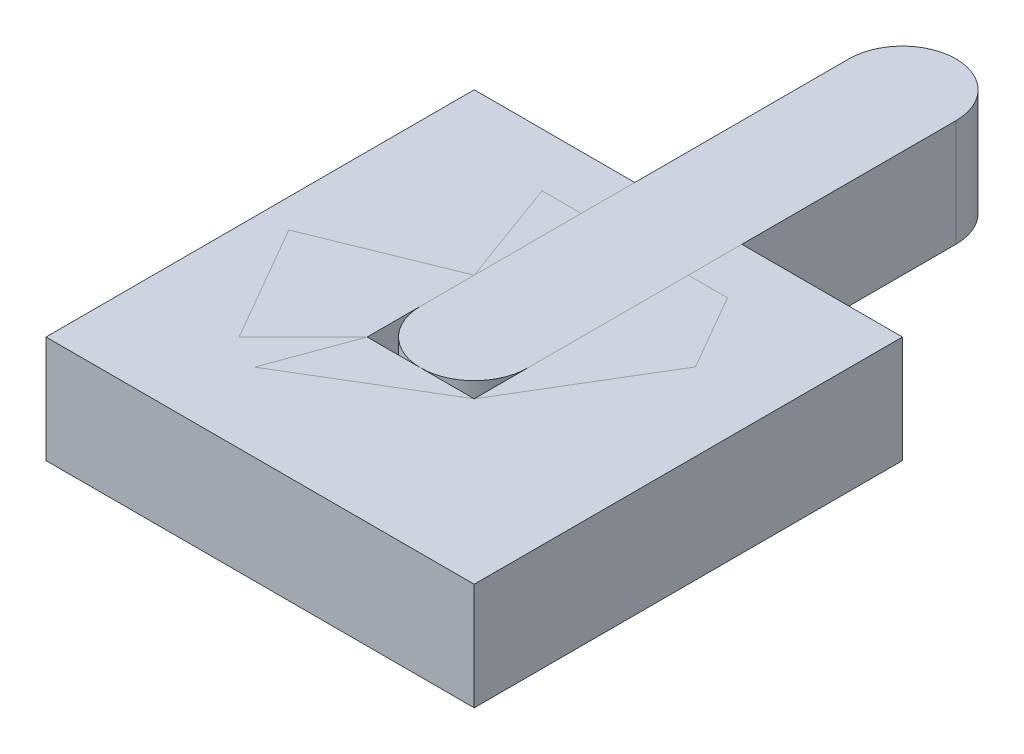
ISO-10303-21;
HEADER;
FILE_DESCRIPTION(('STEP AP214'),'2;1');
FILE_NAME('part.step','',(''),(''),'','','');
FILE_SCHEMA(('AUTOMOTIVE_DESIGN { 1 0 10303 214 1 1 1 1 }'));
ENDSEC;
DATA;
#1=APPLICATION_CONTEXT('core data for automotive mechanical design processes');
#2=APPLICATION_PROTOCOL_DEFINITION('international standard','automotive_design',2000,#1);
#3=PRODUCT_CONTEXT('',#1,'mechanical');
#4=PRODUCT('Part','Part','',(#3));
#5=PRODUCT_RELATED_PRODUCT_CATEGORY('part','',(#4));
#6=PRODUCT_DEFINITION_FORMATION('','',#4);
#7=PRODUCT_DEFINITION_CONTEXT('part definition',#1,'design');
#8=PRODUCT_DEFINITION('design','',#6,#7);
#9=PRODUCT_DEFINITION_SHAPE('','',#8);
#10=(LENGTH_UNIT() NAMED_UNIT(*) SI_UNIT(.MILLI.,.METRE.));
#11=(NAMED_UNIT(*) PLANE_ANGLE_UNIT() SI_UNIT($,.RADIAN.));
#12=(NAMED_UNIT(*) SI_UNIT($,.STERADIAN.) SOLID_ANGLE_UNIT());
#13=UNCERTAINTY_MEASURE_WITH_UNIT(LENGTH_MEASURE(1.E-05),#10,'distance_accuracy_value','');
#14=(GEOMETRIC_REPRESENTATION_CONTEXT(3) GLOBAL_UNCERTAINTY_ASSIGNED_CONTEXT((#13)) GLOBAL_UNIT_ASSIGNED_CONTEXT((#10,
#11,#12)) REPRESENTATION_CONTEXT('',''));
#15=CARTESIAN_POINT('',(0.,0.,0.));
#16=DIRECTION('',(0.,0.,1.));
#17=DIRECTION('',(1.,0.,0.));
#18=AXIS2_PLACEMENT_3D('',#15,#16,#17);
#19=CARTESIAN_POINT('',(1.99185842870421,-2.3,3.45));
#20=DIRECTION('',(0.866025403784439,0.,0.5));
#21=DIRECTION('',(0.5,0.,-0.866025403784439));
#22=AXIS2_PLACEMENT_3D('',#19,#20,#21);
#23=PLANE('',#22);
#24=DIRECTION('',(0.5,0.,-0.866025403784439));
#25=VECTOR('',#24,1.);
#26=CARTESIAN_POINT('',(1.99185842870421,0.,3.45));
#27=LINE('',#26,#25);
#28=CARTESIAN_POINT('',(1.99185842870421,0.,3.45));
#29=VERTEX_POINT('',#28);
#30=CARTESIAN_POINT('',(3.98371685740842,0.,0.));
#31=VERTEX_POINT('',#30);
#32=EDGE_CURVE('E158',#29,#31,#27,.T.);
#33=ORIENTED_EDGE('',*,*,#32,.F.);
#34=DIRECTION('',(0.,1.,0.));
#35=VECTOR('',#34,1.);
#36=CARTESIAN_POINT('',(1.99185842870421,-2.3,3.45));
#37=LINE('',#36,#35);
#38=CARTESIAN_POINT('',(1.99185842870421,-2.3,3.45));
#39=VERTEX_POINT('',#38);
#40=EDGE_CURVE('E12',#39,#29,#37,.T.);
#41=ORIENTED_EDGE('',*,*,#40,.F.);
#42=DIRECTION('',(0.5,0.,-0.866025403784439));
#43=VECTOR('',#42,1.);
#44=CARTESIAN_POINT('',(1.99185842870421,-2.3,3.45));
#45=LINE('',#44,#43);
#46=CARTESIAN_POINT('',(3.98371685740842,-2.3,0.));
#47=VERTEX_POINT('',#46);
#48=EDGE_CURVE('E162',#39,#47,#45,.T.);
#49=ORIENTED_EDGE('',*,*,#48,.T.);
#50=DIRECTION('',(0.,1.,0.));
#51=VECTOR('',#50,1.);
#52=CARTESIAN_POINT('',(3.98371685740842,-2.3,0.));
#53=LINE('',#52,#51);
#54=EDGE_CURVE('E51',#47,#31,#53,.T.);
#55=ORIENTED_EDGE('',*,*,#54,.T.);
#56=EDGE_LOOP('',(#33,#41,#49,#55));
#57=FACE_BOUND('',#56,.T.);
#58=ADVANCED_FACE('F48',(#57),#23,.T.);
#59=CARTESIAN_POINT('',(-1.99185842870421,-2.3,3.45));
#60=DIRECTION('',(0.,0.,1.));
#61=DIRECTION('',(1.,0.,0.));
#62=AXIS2_PLACEMENT_3D('',#59,#60,#61);
#63=PLANE('',#62);
#64=DIRECTION('',(1.,0.,0.));
#65=VECTOR('',#64,1.);
#66=CARTESIAN_POINT('',(-1.99185842870421,0.,3.45));
#67=LINE('',#66,#65);
#68=CARTESIAN_POINT('',(-1.99185842870421,0.,3.45));
#69=VERTEX_POINT('',#68);
#70=EDGE_CURVE('E166',#69,#29,#67,.T.);
#71=ORIENTED_EDGE('',*,*,#70,.F.);
#72=DIRECTION('',(0.,1.,0.));
#73=VECTOR('',#72,1.);
#74=CARTESIAN_POINT('',(-1.99185842870421,-2.3,3.45));
#75=LINE('',#74,#73);
#76=CARTESIAN_POINT('',(-1.99185842870421,-2.3,3.45));
#77=VERTEX_POINT('',#76);
#78=EDGE_CURVE('E56',#77,#69,#75,.T.);
#79=ORIENTED_EDGE('',*,*,#78,.F.);
#80=DIRECTION('',(1.,0.,0.));
#81=VECTOR('',#80,1.);
#82=CARTESIAN_POINT('',(-1.99185842870421,-2.3,3.45));
#83=LINE('',#82,#81);
#84=EDGE_CURVE('E178',#77,#39,#83,.T.);
#85=ORIENTED_EDGE('',*,*,#84,.T.);
#86=ORIENTED_EDGE('',*,*,#40,.T.);
#87=EDGE_LOOP('',(#71,#79,#85,#86));
#88=FACE_BOUND('',#87,.T.);
#89=ADVANCED_FACE('F215',(#88),#63,.T.);
#90=CARTESIAN_POINT('',(-3.98371685740842,-2.3,0.));
#91=DIRECTION('',(-0.866025403784439,0.,0.5));
#92=DIRECTION('',(0.5,0.,0.866025403784439));
#93=AXIS2_PLACEMENT_3D('',#90,#91,#92);
#94=PLANE('',#93);
#95=DIRECTION('',(0.5,0.,0.866025403784439));
#96=VECTOR('',#95,1.);
#97=CARTESIAN_POINT('',(-3.98371685740842,0.,0.));
#98=LINE('',#97,#96);
#99=CARTESIAN_POINT('',(-3.98371685740842,0.,0.));
#100=VERTEX_POINT('',#99);
#101=EDGE_CURVE('E192',#100,#69,#98,.T.);
#102=ORIENTED_EDGE('',*,*,#101,.F.);
#103=DIRECTION('',(0.,1.,0.));
#104=VECTOR('',#103,1.);
#105=CARTESIAN_POINT('',(-3.98371685740842,-2.3,0.));
#106=LINE('',#105,#104);
#107=CARTESIAN_POINT('',(-3.98371685740842,-2.3,0.));
#108=VERTEX_POINT('',#107);
#109=EDGE_CURVE('E198',#108,#100,#106,.T.);
#110=ORIENTED_EDGE('',*,*,#109,.F.);
#111=DIRECTION('',(0.5,0.,0.866025403784439));
#112=VECTOR('',#111,1.);
#113=CARTESIAN_POINT('',(-3.98371685740842,-2.3,0.));
#114=LINE('',#113,#112);
#115=EDGE_CURVE('E175',#108,#77,#114,.T.);
#116=ORIENTED_EDGE('',*,*,#115,.T.);
#117=ORIENTED_EDGE('',*,*,#78,.T.);
#118=EDGE_LOOP('',(#102,#110,#116,#117));
#119=FACE_BOUND('',#118,.T.);
#120=ADVANCED_FACE('F226',(#119),#94,.T.);
#121=CARTESIAN_POINT('',(-1.99185842870421,-2.3,-3.45));
#122=DIRECTION('',(-0.866025403784439,0.,-0.5));
#123=DIRECTION('',(-0.5,0.,0.866025403784439));
#124=AXIS2_PLACEMENT_3D('',#121,#122,#123);
#125=PLANE('',#124);
#126=DIRECTION('',(-0.5,0.,0.866025403784439));
#127=VECTOR('',#126,1.);
#128=CARTESIAN_POINT('',(-1.99185842870421,0.,-3.45));
#129=LINE('',#128,#127);
#130=CARTESIAN_POINT('',(-1.99185842870421,0.,-3.45));
#131=VERTEX_POINT('',#130);
#132=EDGE_CURVE('E189',#131,#100,#129,.T.);
#133=ORIENTED_EDGE('',*,*,#132,.F.);
#134=DIRECTION('',(0.,1.,0.));
#135=VECTOR('',#134,1.);
#136=CARTESIAN_POINT('',(-1.99185842870421,-2.3,-3.45));
#137=LINE('',#136,#135);
#138=CARTESIAN_POINT('',(-1.99185842870421,-2.3,-3.45));
#139=VERTEX_POINT('',#138);
#140=EDGE_CURVE('E200',#139,#131,#137,.T.);
#141=ORIENTED_EDGE('',*,*,#140,.F.);
#142=DIRECTION('',(-0.5,0.,0.866025403784439));
#143=VECTOR('',#142,1.);
#144=CARTESIAN_POINT('',(-1.99185842870421,-2.3,-3.45));
#145=LINE('',#144,#143);
#146=EDGE_CURVE('E172',#139,#108,#145,.T.);
#147=ORIENTED_EDGE('',*,*,#146,.T.);
#148=ORIENTED_EDGE('',*,*,#109,.T.);
#149=EDGE_LOOP('',(#133,#141,#147,#148));
#150=FACE_BOUND('',#149,.T.);
#151=ADVANCED_FACE('F224',(#150),#125,.T.);
#152=CARTESIAN_POINT('',(1.99185842870421,-2.3,-3.45));
#153=DIRECTION('',(0.,0.,-1.));
#154=DIRECTION('',(-1.,0.,0.));
#155=AXIS2_PLACEMENT_3D('',#152,#153,#154);
#156=PLANE('',#155);
#157=DIRECTION('',(-1.,0.,0.));
#158=VECTOR('',#157,1.);
#159=CARTESIAN_POINT('',(1.99185842870421,0.,-3.45));
#160=LINE('',#159,#158);
#161=CARTESIAN_POINT('',(1.99185842870421,0.,-3.45));
#162=VERTEX_POINT('',#161);
#163=EDGE_CURVE('E186',#162,#131,#160,.T.);
#164=ORIENTED_EDGE('',*,*,#163,.F.);
#165=DIRECTION('',(0.,1.,0.));
#166=VECTOR('',#165,1.);
#167=CARTESIAN_POINT('',(1.99185842870421,-2.3,-3.45));
#168=LINE('',#167,#166);
#169=CARTESIAN_POINT('',(1.99185842870421,-2.3,-3.45));
#170=VERTEX_POINT('',#169);
#171=EDGE_CURVE('E201',#170,#162,#168,.T.);
#172=ORIENTED_EDGE('',*,*,#171,.F.);
#173=DIRECTION('',(-1.,0.,0.));
#174=VECTOR('',#173,1.);
#175=CARTESIAN_POINT('',(1.99185842870421,-2.3,-3.45));
#176=LINE('',#175,#174);
#177=EDGE_CURVE('E169',#170,#139,#176,.T.);
#178=ORIENTED_EDGE('',*,*,#177,.T.);
#179=ORIENTED_EDGE('',*,*,#140,.T.);
#180=EDGE_LOOP('',(#164,#172,#178,#179));
#181=FACE_BOUND('',#180,.T.);
#182=ADVANCED_FACE('F221',(#181),#156,.T.);
#183=CARTESIAN_POINT('',(3.98371685740842,-2.3,0.));
#184=DIRECTION('',(0.866025403784439,0.,-0.5));
#185=DIRECTION('',(-0.5,0.,-0.866025403784439));
#186=AXIS2_PLACEMENT_3D('',#183,#184,#185);
#187=PLANE('',#186);
#188=DIRECTION('',(-0.5,0.,-0.866025403784439));
#189=VECTOR('',#188,1.);
#190=CARTESIAN_POINT('',(3.98371685740842,0.,0.));
#191=LINE('',#190,#189);
#192=EDGE_CURVE('E183',#31,#162,#191,.T.);
#193=ORIENTED_EDGE('',*,*,#192,.F.);
#194=ORIENTED_EDGE('',*,*,#54,.F.);
#195=DIRECTION('',(-0.5,0.,-0.866025403784439));
#196=VECTOR('',#195,1.);
#197=CARTESIAN_POINT('',(3.98371685740842,-2.3,0.));
#198=LINE('',#197,#196);
#199=EDGE_CURVE('E165',#47,#170,#198,.T.);
#200=ORIENTED_EDGE('',*,*,#199,.T.);
#201=ORIENTED_EDGE('',*,*,#171,.T.);
#202=EDGE_LOOP('',(#193,#194,#200,#201));
#203=FACE_BOUND('',#202,.T.);
#204=ADVANCED_FACE('F209',(#203),#187,.T.);
#205=CARTESIAN_POINT('',(0.,-2.3,0.));
#206=DIRECTION('',(0.,1.,0.));
#207=DIRECTION('',(0.,0.,1.));
#208=AXIS2_PLACEMENT_3D('',#205,#206,#207);
#209=PLANE('',#208);
#210=DIRECTION('',(1.,0.,0.));
#211=VECTOR('',#210,1.);
#212=CARTESIAN_POINT('',(-1.15,-2.3,1.15));
#213=LINE('',#212,#211);
#214=CARTESIAN_POINT('',(-1.15,-2.3,1.15));
#215=VERTEX_POINT('',#214);
#216=CARTESIAN_POINT('',(1.15,-2.3,1.15));
#217=VERTEX_POINT('',#216);
#218=EDGE_CURVE('E133',#215,#217,#213,.T.);
#219=ORIENTED_EDGE('',*,*,#218,.T.);
#220=DIRECTION('',(0.,0.,-1.));
#221=VECTOR('',#220,1.);
#222=CARTESIAN_POINT('',(1.15,-2.3,1.15));
#223=LINE('',#222,#221);
#224=CARTESIAN_POINT('',(1.15,-2.3,-1.15));
#225=VERTEX_POINT('',#224);
#226=EDGE_CURVE('E127',#217,#225,#223,.T.);
#227=ORIENTED_EDGE('',*,*,#226,.T.);
#228=DIRECTION('',(-1.,0.,0.));
#229=VECTOR('',#228,1.);
#230=CARTESIAN_POINT('',(-1.15,-2.3,-1.15));
#231=LINE('',#230,#229);
#232=CARTESIAN_POINT('',(-1.15,-2.3,-1.15));
#233=VERTEX_POINT('',#232);
#234=EDGE_CURVE('E136',#225,#233,#231,.T.);
#235=ORIENTED_EDGE('',*,*,#234,.T.);
#236=DIRECTION('',(0.,0.,1.));
#237=VECTOR('',#236,1.);
#238=CARTESIAN_POINT('',(-1.15,-2.3,1.15));
#239=LINE('',#238,#237);
#240=EDGE_CURVE('E64',#233,#215,#239,.T.);
#241=ORIENTED_EDGE('',*,*,#240,.T.);
#242=EDGE_LOOP('',(#219,#227,#235,#241));
#243=FACE_BOUND('',#242,.T.);
#244=ORIENTED_EDGE('',*,*,#48,.F.);
#245=ORIENTED_EDGE('',*,*,#84,.F.);
#246=ORIENTED_EDGE('',*,*,#115,.F.);
#247=ORIENTED_EDGE('',*,*,#146,.F.);
#248=ORIENTED_EDGE('',*,*,#177,.F.);
#249=ORIENTED_EDGE('',*,*,#199,.F.);
#250=EDGE_LOOP('',(#244,#245,#246,#247,#248,#249));
#251=FACE_BOUND('',#250,.T.);
#252=ADVANCED_FACE('F140',(#243,#251),#209,.F.);
#253=CARTESIAN_POINT('',(0.,0.,0.));
#254=DIRECTION('',(0.,1.,0.));
#255=DIRECTION('',(0.,0.,1.));
#256=AXIS2_PLACEMENT_3D('',#253,#254,#255);
#257=PLANE('',#256);
#258=DIRECTION('',(0.,0.,-1.));
#259=VECTOR('',#258,1.);
#260=CARTESIAN_POINT('',(1.15,0.,1.15));
#261=LINE('',#260,#259);
#262=CARTESIAN_POINT('',(1.15,0.,1.15));
#263=VERTEX_POINT('',#262);
#264=CARTESIAN_POINT('',(1.15,0.,-1.15));
#265=VERTEX_POINT('',#264);
#266=EDGE_CURVE('E72',#263,#265,#261,.T.);
#267=ORIENTED_EDGE('',*,*,#266,.F.);
#268=DIRECTION('',(1.,0.,0.));
#269=VECTOR('',#268,1.);
#270=CARTESIAN_POINT('',(-1.15,0.,1.15));
#271=LINE('',#270,#269);
#272=CARTESIAN_POINT('',(-1.15,0.,1.15));
#273=VERTEX_POINT('',#272);
#274=EDGE_CURVE('E143',#273,#263,#271,.T.);
#275=ORIENTED_EDGE('',*,*,#274,.F.);
#276=DIRECTION('',(0.,0.,1.));
#277=VECTOR('',#276,1.);
#278=CARTESIAN_POINT('',(-1.15,0.,1.15));
#279=LINE('',#278,#277);
#280=CARTESIAN_POINT('',(-1.15,0.,-1.15));
#281=VERTEX_POINT('',#280);
#282=EDGE_CURVE('E146',#281,#273,#279,.T.);
#283=ORIENTED_EDGE('',*,*,#282,.F.);
#284=DIRECTION('',(-1.,0.,0.));
#285=VECTOR('',#284,1.);
#286=CARTESIAN_POINT('',(-1.15,0.,-1.15));
#287=LINE('',#286,#285);
#288=EDGE_CURVE('E152',#265,#281,#287,.T.);
#289=ORIENTED_EDGE('',*,*,#288,.F.);
#290=EDGE_LOOP('',(#267,#275,#283,#289));
#291=FACE_BOUND('',#290,.T.);
#292=ORIENTED_EDGE('',*,*,#32,.T.);
#293=ORIENTED_EDGE('',*,*,#192,.T.);
#294=ORIENTED_EDGE('',*,*,#163,.T.);
#295=ORIENTED_EDGE('',*,*,#132,.T.);
#296=ORIENTED_EDGE('',*,*,#101,.T.);
#297=ORIENTED_EDGE('',*,*,#70,.T.);
#298=EDGE_LOOP('',(#292,#293,#294,#295,#296,#297));
#299=FACE_BOUND('',#298,.T.);
#300=ADVANCED_FACE('F211',(#291,#299),#257,.T.);
#301=CARTESIAN_POINT('',(1.15,-2.3,1.15));
#302=DIRECTION('',(1.,0.,0.));
#303=DIRECTION('',(0.,0.,-1.));
#304=AXIS2_PLACEMENT_3D('',#301,#302,#303);
#305=PLANE('',#304);
#306=ORIENTED_EDGE('',*,*,#266,.T.);
#307=DIRECTION('',(0.,1.,0.));
#308=VECTOR('',#307,1.);
#309=CARTESIAN_POINT('',(1.15,-2.3,-1.15));
#310=LINE('',#309,#308);
#311=EDGE_CURVE('E123',#225,#265,#310,.T.);
#312=ORIENTED_EDGE('',*,*,#311,.F.);
#313=ORIENTED_EDGE('',*,*,#226,.F.);
#314=DIRECTION('',(0.,1.,0.));
#315=VECTOR('',#314,1.);
#316=CARTESIAN_POINT('',(1.15,-2.3,1.15));
#317=LINE('',#316,#315);
#318=EDGE_CURVE('E156',#217,#263,#317,.T.);
#319=ORIENTED_EDGE('',*,*,#318,.T.);
#320=EDGE_LOOP('',(#306,#312,#313,#319));
#321=FACE_BOUND('',#320,.T.);
#322=ADVANCED_FACE('F125',(#321),#305,.F.);
#323=CARTESIAN_POINT('',(-1.15,-2.3,1.15));
#324=DIRECTION('',(0.,0.,1.));
#325=DIRECTION('',(1.,0.,0.));
#326=AXIS2_PLACEMENT_3D('',#323,#324,#325);
#327=PLANE('',#326);
#328=ORIENTED_EDGE('',*,*,#274,.T.);
#329=ORIENTED_EDGE('',*,*,#318,.F.);
#330=ORIENTED_EDGE('',*,*,#218,.F.);
#331=DIRECTION('',(0.,1.,0.));
#332=VECTOR('',#331,1.);
#333=CARTESIAN_POINT('',(-1.15,-2.3,1.15));
#334=LINE('',#333,#332);
#335=EDGE_CURVE('E159',#215,#273,#334,.T.);
#336=ORIENTED_EDGE('',*,*,#335,.T.);
#337=EDGE_LOOP('',(#328,#329,#330,#336));
#338=FACE_BOUND('',#337,.T.);
#339=ADVANCED_FACE('F300',(#338),#327,.F.);
#340=CARTESIAN_POINT('',(-1.15,-2.3,1.15));
#341=DIRECTION('',(-1.,0.,0.));
#342=DIRECTION('',(0.,0.,1.));
#343=AXIS2_PLACEMENT_3D('',#340,#341,#342);
#344=PLANE('',#343);
#345=ORIENTED_EDGE('',*,*,#282,.T.);
#346=ORIENTED_EDGE('',*,*,#335,.F.);
#347=ORIENTED_EDGE('',*,*,#240,.F.);
#348=DIRECTION('',(0.,1.,0.));
#349=VECTOR('',#348,1.);
#350=CARTESIAN_POINT('',(-1.15,-2.3,-1.15));
#351=LINE('',#350,#349);
#352=EDGE_CURVE('E132',#233,#281,#351,.T.);
#353=ORIENTED_EDGE('',*,*,#352,.T.);
#354=EDGE_LOOP('',(#345,#346,#347,#353));
#355=FACE_BOUND('',#354,.T.);
#356=ADVANCED_FACE('F309',(#355),#344,.F.);
#357=CARTESIAN_POINT('',(-1.15,-2.3,-1.15));
#358=DIRECTION('',(0.,0.,-1.));
#359=DIRECTION('',(-1.,0.,0.));
#360=AXIS2_PLACEMENT_3D('',#357,#358,#359);
#361=PLANE('',#360);
#362=ORIENTED_EDGE('',*,*,#288,.T.);
#363=ORIENTED_EDGE('',*,*,#352,.F.);
#364=ORIENTED_EDGE('',*,*,#234,.F.);
#365=ORIENTED_EDGE('',*,*,#311,.T.);
#366=EDGE_LOOP('',(#362,#363,#364,#365));
#367=FACE_BOUND('',#366,.T.);
#368=ADVANCED_FACE('F137',(#367),#361,.F.);
#369=CLOSED_SHELL('',(#58,#89,#120,#151,#182,#204,#252,#300,#322,#339,#356,#368));
#370=MANIFOLD_SOLID_BREP('B2_NOT_SHOWN',#369);
#371=CARTESIAN_POINT('',(4.6,-2.3,4.6));
#372=DIRECTION('',(1.,0.,0.));
#373=DIRECTION('',(0.,0.,-1.));
#374=AXIS2_PLACEMENT_3D('',#371,#372,#373);
#375=PLANE('',#374);
#376=DIRECTION('',(0.,0.,-1.));
#377=VECTOR('',#376,1.);
#378=CARTESIAN_POINT('',(4.6,0.,4.6));
#379=LINE('',#378,#377);
#380=CARTESIAN_POINT('',(4.6,0.,4.6));
#381=VERTEX_POINT('',#380);
#382=CARTESIAN_POINT('',(4.6,0.,-4.6));
#383=VERTEX_POINT('',#382);
#384=EDGE_CURVE('E422',#381,#383,#379,.T.);
#385=ORIENTED_EDGE('',*,*,#384,.F.);
#386=DIRECTION('',(0.,1.,0.));
#387=VECTOR('',#386,1.);
#388=CARTESIAN_POINT('',(4.6,-2.3,4.6));
#389=LINE('',#388,#387);
#390=CARTESIAN_POINT('',(4.6,-2.3,4.6));
#391=VERTEX_POINT('',#390);
#392=EDGE_CURVE('E46',#391,#381,#389,.T.);
#393=ORIENTED_EDGE('',*,*,#392,.F.);
#394=DIRECTION('',(0.,0.,-1.));
#395=VECTOR('',#394,1.);
#396=CARTESIAN_POINT('',(4.6,-2.3,4.6));
#397=LINE('',#396,#395);
#398=CARTESIAN_POINT('',(4.6,-2.3,-4.6));
#399=VERTEX_POINT('',#398);
#400=EDGE_CURVE('E455',#391,#399,#397,.T.);
#401=ORIENTED_EDGE('',*,*,#400,.T.);
#402=DIRECTION('',(0.,1.,0.));
#403=VECTOR('',#402,1.);
#404=CARTESIAN_POINT('',(4.6,-2.3,-4.6));
#405=LINE('',#404,#403);
#406=EDGE_CURVE('E358',#399,#383,#405,.T.);
#407=ORIENTED_EDGE('',*,*,#406,.T.);
#408=EDGE_LOOP('',(#385,#393,#401,#407));
#409=FACE_BOUND('',#408,.T.);
#410=ADVANCED_FACE('F355',(#409),#375,.T.);
#411=CARTESIAN_POINT('',(-4.6,-2.3,4.6));
#412=DIRECTION('',(0.,0.,1.));
#413=DIRECTION('',(1.,0.,0.));
#414=AXIS2_PLACEMENT_3D('',#411,#412,#413);
#415=PLANE('',#414);
#416=DIRECTION('',(1.,0.,0.));
#417=VECTOR('',#416,1.);
#418=CARTESIAN_POINT('',(-4.6,0.,4.6));
#419=LINE('',#418,#417);
#420=CARTESIAN_POINT('',(-4.6,0.,4.6));
#421=VERTEX_POINT('',#420);
#422=EDGE_CURVE('E459',#421,#381,#419,.T.);
#423=ORIENTED_EDGE('',*,*,#422,.F.);
#424=DIRECTION('',(0.,1.,0.));
#425=VECTOR('',#424,1.);
#426=CARTESIAN_POINT('',(-4.6,-2.3,4.6));
#427=LINE('',#426,#425);
#428=CARTESIAN_POINT('',(-4.6,-2.3,4.6));
#429=VERTEX_POINT('',#428);
#430=EDGE_CURVE('E363',#429,#421,#427,.T.);
#431=ORIENTED_EDGE('',*,*,#430,.F.);
#432=DIRECTION('',(1.,0.,0.));
#433=VECTOR('',#432,1.);
#434=CARTESIAN_POINT('',(-4.6,-2.3,4.6));
#435=LINE('',#434,#433);
#436=EDGE_CURVE('E465',#429,#391,#435,.T.);
#437=ORIENTED_EDGE('',*,*,#436,.T.);
#438=ORIENTED_EDGE('',*,*,#392,.T.);
#439=EDGE_LOOP('',(#423,#431,#437,#438));
#440=FACE_BOUND('',#439,.T.);
#441=ADVANCED_FACE('F491',(#440),#415,.T.);
#442=CARTESIAN_POINT('',(-4.6,-2.3,4.6));
#443=DIRECTION('',(-1.,0.,0.));
#444=DIRECTION('',(0.,0.,1.));
#445=AXIS2_PLACEMENT_3D('',#442,#443,#444);
#446=PLANE('',#445);
#447=DIRECTION('',(0.,0.,1.));
#448=VECTOR('',#447,1.);
#449=CARTESIAN_POINT('',(-4.6,0.,4.6));
#450=LINE('',#449,#448);
#451=CARTESIAN_POINT('',(-4.6,0.,-4.6));
#452=VERTEX_POINT('',#451);
#453=EDGE_CURVE('E473',#452,#421,#450,.T.);
#454=ORIENTED_EDGE('',*,*,#453,.F.);
#455=DIRECTION('',(0.,1.,0.));
#456=VECTOR('',#455,1.);
#457=CARTESIAN_POINT('',(-4.6,-2.3,-4.6));
#458=LINE('',#457,#456);
#459=CARTESIAN_POINT('',(-4.6,-2.3,-4.6));
#460=VERTEX_POINT('',#459);
#461=EDGE_CURVE('E478',#460,#452,#458,.T.);
#462=ORIENTED_EDGE('',*,*,#461,.F.);
#463=DIRECTION('',(0.,0.,1.));
#464=VECTOR('',#463,1.);
#465=CARTESIAN_POINT('',(-4.6,-2.3,4.6));
#466=LINE('',#465,#464);
#467=EDGE_CURVE('E462',#460,#429,#466,.T.);
#468=ORIENTED_EDGE('',*,*,#467,.T.);
#469=ORIENTED_EDGE('',*,*,#430,.T.);
#470=EDGE_LOOP('',(#454,#462,#468,#469));
#471=FACE_BOUND('',#470,.T.);
#472=ADVANCED_FACE('F495',(#471),#446,.T.);
#473=CARTESIAN_POINT('',(-4.6,-2.3,-4.6));
#474=DIRECTION('',(0.,0.,-1.));
#475=DIRECTION('',(-1.,0.,0.));
#476=AXIS2_PLACEMENT_3D('',#473,#474,#475);
#477=PLANE('',#476);
#478=DIRECTION('',(-1.,0.,0.));
#479=VECTOR('',#478,1.);
#480=CARTESIAN_POINT('',(-4.6,0.,-4.6));
#481=LINE('',#480,#479);
#482=EDGE_CURVE('E470',#383,#452,#481,.T.);
#483=ORIENTED_EDGE('',*,*,#482,.F.);
#484=ORIENTED_EDGE('',*,*,#406,.F.);
#485=DIRECTION('',(-1.,0.,0.));
#486=VECTOR('',#485,1.);
#487=CARTESIAN_POINT('',(-4.6,-2.3,-4.6));
#488=LINE('',#487,#486);
#489=EDGE_CURVE('E458',#399,#460,#488,.T.);
#490=ORIENTED_EDGE('',*,*,#489,.T.);
#491=ORIENTED_EDGE('',*,*,#461,.T.);
#492=EDGE_LOOP('',(#483,#484,#490,#491));
#493=FACE_BOUND('',#492,.T.);
#494=ADVANCED_FACE('F486',(#493),#477,.T.);
#495=CARTESIAN_POINT('',(0.,-2.3,0.));
#496=DIRECTION('',(0.,-1.,0.));
#497=DIRECTION('',(0.,0.,-1.));
#498=AXIS2_PLACEMENT_3D('',#495,#496,#497);
#499=PLANE('',#498);
#500=DIRECTION('',(0.,0.,-1.));
#501=VECTOR('',#500,1.);
#502=CARTESIAN_POINT('',(1.15,-2.3,1.15));
#503=LINE('',#502,#501);
#504=CARTESIAN_POINT('',(1.15,-2.3,1.15));
#505=VERTEX_POINT('',#504);
#506=CARTESIAN_POINT('',(1.15,-2.3,-1.15));
#507=VERTEX_POINT('',#506);
#508=EDGE_CURVE('E428',#505,#507,#503,.T.);
#509=ORIENTED_EDGE('',*,*,#508,.T.);
#510=DIRECTION('',(-1.,0.,0.));
#511=VECTOR('',#510,1.);
#512=CARTESIAN_POINT('',(-1.15,-2.3,-1.15));
#513=LINE('',#512,#511);
#514=CARTESIAN_POINT('',(-1.15,-2.3,-1.15));
#515=VERTEX_POINT('',#514);
#516=EDGE_CURVE('E417',#507,#515,#513,.T.);
#517=ORIENTED_EDGE('',*,*,#516,.T.);
#518=DIRECTION('',(0.,0.,1.));
#519=VECTOR('',#518,1.);
#520=CARTESIAN_POINT('',(-1.15,-2.3,1.15));
#521=LINE('',#520,#519);
#522=CARTESIAN_POINT('',(-1.15,-2.3,1.15));
#523=VERTEX_POINT('',#522);
#524=EDGE_CURVE('E442',#515,#523,#521,.T.);
#525=ORIENTED_EDGE('',*,*,#524,.T.);
#526=DIRECTION('',(1.,0.,0.));
#527=VECTOR('',#526,1.);
#528=CARTESIAN_POINT('',(-1.15,-2.3,1.15));
#529=LINE('',#528,#527);
#530=EDGE_CURVE('E438',#523,#505,#529,.T.);
#531=ORIENTED_EDGE('',*,*,#530,.T.);
#532=EDGE_LOOP('',(#509,#517,#525,#531));
#533=FACE_BOUND('',#532,.T.);
#534=ORIENTED_EDGE('',*,*,#400,.F.);
#535=ORIENTED_EDGE('',*,*,#436,.F.);
#536=ORIENTED_EDGE('',*,*,#467,.F.);
#537=ORIENTED_EDGE('',*,*,#489,.F.);
#538=EDGE_LOOP('',(#534,#535,#536,#537));
#539=FACE_BOUND('',#538,.T.);
#540=ADVANCED_FACE('F436',(#533,#539),#499,.T.);
#541=CARTESIAN_POINT('',(0.,0.,0.));
#542=DIRECTION('',(0.,-1.,0.));
#543=DIRECTION('',(0.,0.,-1.));
#544=AXIS2_PLACEMENT_3D('',#541,#542,#543);
#545=PLANE('',#544);
#546=DIRECTION('',(-1.,0.,0.));
#547=VECTOR('',#546,1.);
#548=CARTESIAN_POINT('',(-1.15,0.,-1.15));
#549=LINE('',#548,#547);
#550=CARTESIAN_POINT('',(1.15,0.,-1.15));
#551=VERTEX_POINT('',#550);
#552=CARTESIAN_POINT('',(-1.15,0.,-1.15));
#553=VERTEX_POINT('',#552);
#554=EDGE_CURVE('E440',#551,#553,#549,.T.);
#555=ORIENTED_EDGE('',*,*,#554,.F.);
#556=DIRECTION('',(0.,0.,-1.));
#557=VECTOR('',#556,1.);
#558=CARTESIAN_POINT('',(1.15,0.,1.15));
#559=LINE('',#558,#557);
#560=CARTESIAN_POINT('',(1.15,0.,1.15));
#561=VERTEX_POINT('',#560);
#562=EDGE_CURVE('E431',#561,#551,#559,.T.);
#563=ORIENTED_EDGE('',*,*,#562,.F.);
#564=DIRECTION('',(1.,0.,0.));
#565=VECTOR('',#564,1.);
#566=CARTESIAN_POINT('',(-1.15,0.,1.15));
#567=LINE('',#566,#565);
#568=CARTESIAN_POINT('',(-1.15,0.,1.15));
#569=VERTEX_POINT('',#568);
#570=EDGE_CURVE('E433',#569,#561,#567,.T.);
#571=ORIENTED_EDGE('',*,*,#570,.F.);
#572=DIRECTION('',(0.,0.,1.));
#573=VECTOR('',#572,1.);
#574=CARTESIAN_POINT('',(-1.15,0.,1.15));
#575=LINE('',#574,#573);
#576=EDGE_CURVE('E447',#553,#569,#575,.T.);
#577=ORIENTED_EDGE('',*,*,#576,.F.);
#578=EDGE_LOOP('',(#555,#563,#571,#577));
#579=FACE_BOUND('',#578,.T.);
#580=ORIENTED_EDGE('',*,*,#384,.T.);
#581=ORIENTED_EDGE('',*,*,#482,.T.);
#582=ORIENTED_EDGE('',*,*,#453,.T.);
#583=ORIENTED_EDGE('',*,*,#422,.T.);
#584=EDGE_LOOP('',(#580,#581,#582,#583));
#585=FACE_BOUND('',#584,.T.);
#586=ADVANCED_FACE('F488',(#579,#585),#545,.F.);
#587=CARTESIAN_POINT('',(1.15,-2.301,1.15));
#588=DIRECTION('',(1.,0.,0.));
#589=DIRECTION('',(0.,0.,-1.));
#590=AXIS2_PLACEMENT_3D('',#587,#588,#589);
#591=PLANE('',#590);
#592=DIRECTION('',(0.,1.,0.));
#593=VECTOR('',#592,1.);
#594=CARTESIAN_POINT('',(1.15,-2.301,-1.15));
#595=LINE('',#594,#593);
#596=EDGE_CURVE('E376',#507,#551,#595,.T.);
#597=ORIENTED_EDGE('',*,*,#596,.F.);
#598=ORIENTED_EDGE('',*,*,#508,.F.);
#599=DIRECTION('',(0.,1.,0.));
#600=VECTOR('',#599,1.);
#601=CARTESIAN_POINT('',(1.15,-2.301,1.15));
#602=LINE('',#601,#600);
#603=EDGE_CURVE('E423',#505,#561,#602,.T.);
#604=ORIENTED_EDGE('',*,*,#603,.T.);
#605=ORIENTED_EDGE('',*,*,#562,.T.);
#606=EDGE_LOOP('',(#597,#598,#604,#605));
#607=FACE_BOUND('',#606,.T.);
#608=ADVANCED_FACE('F426',(#607),#591,.F.);
#609=CARTESIAN_POINT('',(-1.15,-2.301,1.15));
#610=DIRECTION('',(0.,0.,1.));
#611=DIRECTION('',(1.,0.,0.));
#612=AXIS2_PLACEMENT_3D('',#609,#610,#611);
#613=PLANE('',#612);
#614=ORIENTED_EDGE('',*,*,#603,.F.);
#615=ORIENTED_EDGE('',*,*,#530,.F.);
#616=DIRECTION('',(0.,1.,0.));
#617=VECTOR('',#616,1.);
#618=CARTESIAN_POINT('',(-1.15,-2.301,1.15));
#619=LINE('',#618,#617);
#620=EDGE_CURVE('E451',#523,#569,#619,.T.);
#621=ORIENTED_EDGE('',*,*,#620,.T.);
#622=ORIENTED_EDGE('',*,*,#570,.T.);
#623=EDGE_LOOP('',(#614,#615,#621,#622));
#624=FACE_BOUND('',#623,.T.);
#625=ADVANCED_FACE('F551',(#624),#613,.F.);
#626=CARTESIAN_POINT('',(-1.15,-2.301,1.15));
#627=DIRECTION('',(-1.,0.,0.));
#628=DIRECTION('',(0.,0.,1.));
#629=AXIS2_PLACEMENT_3D('',#626,#627,#628);
#630=PLANE('',#629);
#631=ORIENTED_EDGE('',*,*,#620,.F.);
#632=ORIENTED_EDGE('',*,*,#524,.F.);
#633=DIRECTION('',(0.,1.,0.));
#634=VECTOR('',#633,1.);
#635=CARTESIAN_POINT('',(-1.15,-2.301,-1.15));
#636=LINE('',#635,#634);
#637=EDGE_CURVE('E371',#515,#553,#636,.T.);
#638=ORIENTED_EDGE('',*,*,#637,.T.);
#639=ORIENTED_EDGE('',*,*,#576,.T.);
#640=EDGE_LOOP('',(#631,#632,#638,#639));
#641=FACE_BOUND('',#640,.T.);
#642=ADVANCED_FACE('F560',(#641),#630,.F.);
#643=CARTESIAN_POINT('',(-1.15,-2.301,-1.15));
#644=DIRECTION('',(0.,0.,-1.));
#645=DIRECTION('',(-1.,0.,0.));
#646=AXIS2_PLACEMENT_3D('',#643,#644,#645);
#647=PLANE('',#646);
#648=ORIENTED_EDGE('',*,*,#596,.T.);
#649=ORIENTED_EDGE('',*,*,#554,.T.);
#650=ORIENTED_EDGE('',*,*,#637,.F.);
#651=ORIENTED_EDGE('',*,*,#516,.F.);
#652=EDGE_LOOP('',(#648,#649,#650,#651));
#653=FACE_BOUND('',#652,.T.);
#654=ADVANCED_FACE('F418',(#653),#647,.F.);
#655=CLOSED_SHELL('',(#410,#441,#472,#494,#540,#586,#608,#625,#642,#654));
#656=MANIFOLD_SOLID_BREP('B6',#655);
#657=CARTESIAN_POINT('',(0.,-2.3,0.));
#658=DIRECTION('',(0.,1.,0.));
#659=DIRECTION('',(0.,0.,1.));
#660=AXIS2_PLACEMENT_3D('',#657,#658,#659);
#661=CYLINDRICAL_SURFACE('',#660,1.15);
#662=CARTESIAN_POINT('',(0.,0.,0.));
#663=DIRECTION('',(0.,1.,0.));
#664=DIRECTION('',(0.,0.,1.));
#665=AXIS2_PLACEMENT_3D('',#662,#663,#664);
#666=CIRCLE('',#665,1.15);
#667=CARTESIAN_POINT('',(-1.15,0.,0.));
#668=VERTEX_POINT('',#667);
#669=CARTESIAN_POINT('',(1.15,0.,0.));
#670=VERTEX_POINT('',#669);
#671=EDGE_CURVE('E661',#668,#670,#666,.T.);
#672=ORIENTED_EDGE('',*,*,#671,.F.);
#673=DIRECTION('',(0.,1.,0.));
#674=VECTOR('',#673,1.);
#675=CARTESIAN_POINT('',(-1.15,-2.3,0.));
#676=LINE('',#675,#674);
#677=CARTESIAN_POINT('',(-1.15,-2.3,0.));
#678=VERTEX_POINT('',#677);
#679=EDGE_CURVE('E353',#678,#668,#676,.T.);
#680=ORIENTED_EDGE('',*,*,#679,.F.);
#681=CARTESIAN_POINT('',(0.,-2.3,0.));
#682=DIRECTION('',(0.,1.,0.));
#683=DIRECTION('',(0.,0.,1.));
#684=AXIS2_PLACEMENT_3D('',#681,#682,#683);
#685=CIRCLE('',#684,1.15);
#686=CARTESIAN_POINT('',(1.15,-2.3,0.));
#687=VERTEX_POINT('',#686);
#688=EDGE_CURVE('E655',#678,#687,#685,.T.);
#689=ORIENTED_EDGE('',*,*,#688,.T.);
#690=DIRECTION('',(0.,1.,0.));
#691=VECTOR('',#690,1.);
#692=CARTESIAN_POINT('',(1.15,-2.3,0.));
#693=LINE('',#692,#691);
#694=EDGE_CURVE('E600',#687,#670,#693,.T.);
#695=ORIENTED_EDGE('',*,*,#694,.T.);
#696=EDGE_LOOP('',(#672,#680,#689,#695));
#697=FACE_BOUND('',#696,.T.);
#698=ADVANCED_FACE('F597',(#697),#661,.T.);
#699=CARTESIAN_POINT('',(-1.15,-2.3,0.));
#700=DIRECTION('',(-1.,0.,0.));
#701=DIRECTION('',(0.,0.,1.));
#702=AXIS2_PLACEMENT_3D('',#699,#700,#701);
#703=PLANE('',#702);
#704=DIRECTION('',(0.,0.,1.));
#705=VECTOR('',#704,1.);
#706=CARTESIAN_POINT('',(-1.15,0.,0.));
#707=LINE('',#706,#705);
#708=CARTESIAN_POINT('',(-1.15,0.,-9.2));
#709=VERTEX_POINT('',#708);
#710=EDGE_CURVE('E657',#709,#668,#707,.T.);
#711=ORIENTED_EDGE('',*,*,#710,.F.);
#712=DIRECTION('',(0.,1.,0.));
#713=VECTOR('',#712,1.);
#714=CARTESIAN_POINT('',(-1.15,-2.3,-9.2));
#715=LINE('',#714,#713);
#716=CARTESIAN_POINT('',(-1.15,-2.3,-9.2));
#717=VERTEX_POINT('',#716);
#718=EDGE_CURVE('E606',#717,#709,#715,.T.);
#719=ORIENTED_EDGE('',*,*,#718,.F.);
#720=DIRECTION('',(0.,0.,1.));
#721=VECTOR('',#720,1.);
#722=CARTESIAN_POINT('',(-1.15,-2.3,0.));
#723=LINE('',#722,#721);
#724=EDGE_CURVE('E652',#717,#678,#723,.T.);
#725=ORIENTED_EDGE('',*,*,#724,.T.);
#726=ORIENTED_EDGE('',*,*,#679,.T.);
#727=EDGE_LOOP('',(#711,#719,#725,#726));
#728=FACE_BOUND('',#727,.T.);
#729=ADVANCED_FACE('F671',(#728),#703,.T.);
#730=CARTESIAN_POINT('',(0.,-2.3,-9.2));
#731=DIRECTION('',(0.,1.,0.));
#732=DIRECTION('',(0.,0.,1.));
#733=AXIS2_PLACEMENT_3D('',#730,#731,#732);
#734=CYLINDRICAL_SURFACE('',#733,1.15);
#735=CARTESIAN_POINT('',(0.,0.,-9.2));
#736=DIRECTION('',(0.,1.,0.));
#737=DIRECTION('',(0.,0.,1.));
#738=AXIS2_PLACEMENT_3D('',#735,#736,#737);
#739=CIRCLE('',#738,1.15);
#740=CARTESIAN_POINT('',(1.15,0.,-9.2));
#741=VERTEX_POINT('',#740);
#742=EDGE_CURVE('E647',#741,#709,#739,.T.);
#743=ORIENTED_EDGE('',*,*,#742,.F.);
#744=DIRECTION('',(0.,1.,0.));
#745=VECTOR('',#744,1.);
#746=CARTESIAN_POINT('',(1.15,-2.3,-9.2));
#747=LINE('',#746,#745);
#748=CARTESIAN_POINT('',(1.15,-2.3,-9.2));
#749=VERTEX_POINT('',#748);
#750=EDGE_CURVE('E642',#749,#741,#747,.T.);
#751=ORIENTED_EDGE('',*,*,#750,.F.);
#752=CARTESIAN_POINT('',(0.,-2.3,-9.2));
#753=DIRECTION('',(0.,1.,0.));
#754=DIRECTION('',(0.,0.,1.));
#755=AXIS2_PLACEMENT_3D('',#752,#753,#754);
#756=CIRCLE('',#755,1.15);
#757=EDGE_CURVE('E645',#749,#717,#756,.T.);
#758=ORIENTED_EDGE('',*,*,#757,.T.);
#759=ORIENTED_EDGE('',*,*,#718,.T.);
#760=EDGE_LOOP('',(#743,#751,#758,#759));
#761=FACE_BOUND('',#760,.T.);
#762=ADVANCED_FACE('F644',(#761),#734,.T.);
#763=CARTESIAN_POINT('',(1.15,-2.3,0.));
#764=DIRECTION('',(1.,0.,0.));
#765=DIRECTION('',(0.,0.,-1.));
#766=AXIS2_PLACEMENT_3D('',#763,#764,#765);
#767=PLANE('',#766);
#768=DIRECTION('',(0.,0.,-1.));
#769=VECTOR('',#768,1.);
#770=CARTESIAN_POINT('',(1.15,0.,0.));
#771=LINE('',#770,#769);
#772=EDGE_CURVE('E664',#670,#741,#771,.T.);
#773=ORIENTED_EDGE('',*,*,#772,.F.);
#774=ORIENTED_EDGE('',*,*,#694,.F.);
#775=DIRECTION('',(0.,0.,-1.));
#776=VECTOR('',#775,1.);
#777=CARTESIAN_POINT('',(1.15,-2.3,0.));
#778=LINE('',#777,#776);
#779=EDGE_CURVE('E651',#687,#749,#778,.T.);
#780=ORIENTED_EDGE('',*,*,#779,.T.);
#781=ORIENTED_EDGE('',*,*,#750,.T.);
#782=EDGE_LOOP('',(#773,#774,#780,#781));
#783=FACE_BOUND('',#782,.T.);
#784=ADVANCED_FACE('F654',(#783),#767,.T.);
#785=CARTESIAN_POINT('',(0.,-2.3,0.));
#786=DIRECTION('',(0.,1.,0.));
#787=DIRECTION('',(0.,0.,1.));
#788=AXIS2_PLACEMENT_3D('',#785,#786,#787);
#789=PLANE('',#788);
#790=ORIENTED_EDGE('',*,*,#688,.F.);
#791=ORIENTED_EDGE('',*,*,#724,.F.);
#792=ORIENTED_EDGE('',*,*,#757,.F.);
#793=ORIENTED_EDGE('',*,*,#779,.F.);
#794=EDGE_LOOP('',(#790,#791,#792,#793));
#795=FACE_BOUND('',#794,.T.);
#796=ADVANCED_FACE('F650',(#795),#789,.F.);
#797=CARTESIAN_POINT('',(0.,0.,0.));
#798=DIRECTION('',(0.,1.,0.));
#799=DIRECTION('',(0.,0.,1.));
#800=AXIS2_PLACEMENT_3D('',#797,#798,#799);
#801=PLANE('',#800);
#802=ORIENTED_EDGE('',*,*,#671,.T.);
#803=ORIENTED_EDGE('',*,*,#772,.T.);
#804=ORIENTED_EDGE('',*,*,#742,.T.);
#805=ORIENTED_EDGE('',*,*,#710,.T.);
#806=EDGE_LOOP('',(#802,#803,#804,#805));
#807=FACE_BOUND('',#806,.T.);
#808=ADVANCED_FACE('F670',(#807),#801,.T.);
#809=CLOSED_SHELL('',(#698,#729,#762,#784,#796,#808));
#810=MANIFOLD_SOLID_BREP('B40_NOT_SHOWN',#809);
#811=ADVANCED_BREP_SHAPE_REPRESENTATION('',(#18,#370,#656,#810),#14);
#812=SHAPE_DEFINITION_REPRESENTATION(#9,#811);
ENDSEC;
END-ISO-10303-21;
